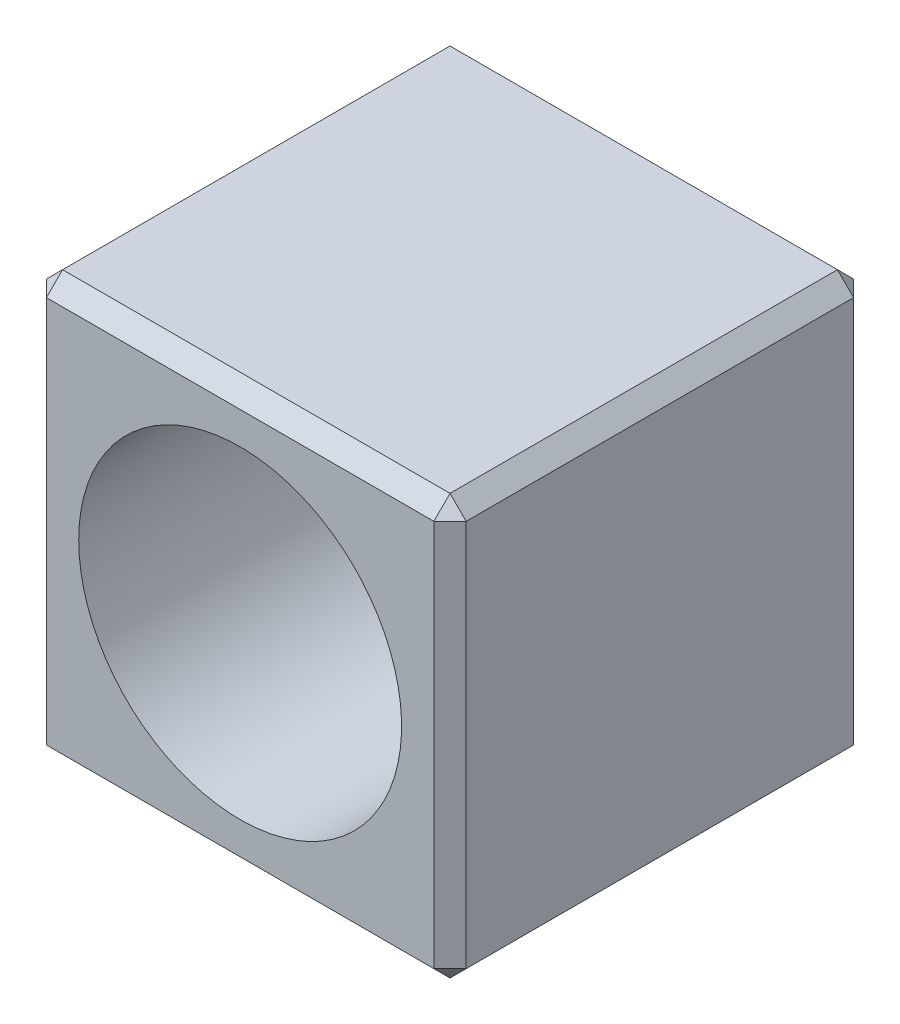
ISO-10303-21;
HEADER;
FILE_DESCRIPTION(('STEP AP214'),'2;1');
FILE_NAME('part.step','',(''),(''),'','','');
FILE_SCHEMA(('AUTOMOTIVE_DESIGN { 1 0 10303 214 1 1 1 1 }'));
ENDSEC;
DATA;
#1=APPLICATION_CONTEXT('core data for automotive mechanical design processes');
#2=APPLICATION_PROTOCOL_DEFINITION('international standard','automotive_design',2000,#1);
#3=PRODUCT_CONTEXT('',#1,'mechanical');
#4=PRODUCT('Part','Part','',(#3));
#5=PRODUCT_RELATED_PRODUCT_CATEGORY('part','',(#4));
#6=PRODUCT_DEFINITION_FORMATION('','',#4);
#7=PRODUCT_DEFINITION_CONTEXT('part definition',#1,'design');
#8=PRODUCT_DEFINITION('design','',#6,#7);
#9=PRODUCT_DEFINITION_SHAPE('','',#8);
#10=(LENGTH_UNIT() NAMED_UNIT(*) SI_UNIT(.MILLI.,.METRE.));
#11=(NAMED_UNIT(*) PLANE_ANGLE_UNIT() SI_UNIT($,.RADIAN.));
#12=(NAMED_UNIT(*) SI_UNIT($,.STERADIAN.) SOLID_ANGLE_UNIT());
#13=UNCERTAINTY_MEASURE_WITH_UNIT(LENGTH_MEASURE(1.E-05),#10,'distance_accuracy_value','');
#14=(GEOMETRIC_REPRESENTATION_CONTEXT(3) GLOBAL_UNCERTAINTY_ASSIGNED_CONTEXT((#13)) GLOBAL_UNIT_ASSIGNED_CONTEXT((#10,
#11,#12)) REPRESENTATION_CONTEXT('',''));
#15=CARTESIAN_POINT('',(0.,0.,0.));
#16=DIRECTION('',(0.,0.,1.));
#17=DIRECTION('',(1.,0.,0.));
#18=AXIS2_PLACEMENT_3D('',#15,#16,#17);
#19=CARTESIAN_POINT('',(0.,0.,13.));
#20=DIRECTION('',(0.,0.,1.));
#21=DIRECTION('',(1.,0.,0.));
#22=AXIS2_PLACEMENT_3D('',#19,#20,#21);
#23=PLANE('',#22);
#24=DIRECTION('',(0.,1.,0.));
#25=VECTOR('',#24,1.);
#26=CARTESIAN_POINT('',(6.,6.5,13.));
#27=LINE('',#26,#25);
#28=CARTESIAN_POINT('',(6.,-6.,13.));
#29=VERTEX_POINT('',#28);
#30=CARTESIAN_POINT('',(6.,6.,13.));
#31=VERTEX_POINT('',#30);
#32=EDGE_CURVE('E184',#29,#31,#27,.T.);
#33=ORIENTED_EDGE('',*,*,#32,.T.);
#34=DIRECTION('',(-1.,0.,0.));
#35=VECTOR('',#34,1.);
#36=CARTESIAN_POINT('',(-6.5,6.,13.));
#37=LINE('',#36,#35);
#38=CARTESIAN_POINT('',(-6.,6.,13.));
#39=VERTEX_POINT('',#38);
#40=EDGE_CURVE('E190',#31,#39,#37,.T.);
#41=ORIENTED_EDGE('',*,*,#40,.T.);
#42=DIRECTION('',(0.,-1.,0.));
#43=VECTOR('',#42,1.);
#44=CARTESIAN_POINT('',(-6.,-6.5,13.));
#45=LINE('',#44,#43);
#46=CARTESIAN_POINT('',(-6.,-6.,13.));
#47=VERTEX_POINT('',#46);
#48=EDGE_CURVE('E188',#39,#47,#45,.T.);
#49=ORIENTED_EDGE('',*,*,#48,.T.);
#50=DIRECTION('',(1.,0.,0.));
#51=VECTOR('',#50,1.);
#52=CARTESIAN_POINT('',(6.5,-6.,13.));
#53=LINE('',#52,#51);
#54=EDGE_CURVE('E186',#47,#29,#53,.T.);
#55=ORIENTED_EDGE('',*,*,#54,.T.);
#56=EDGE_LOOP('',(#33,#41,#49,#55));
#57=FACE_BOUND('',#56,.T.);
#58=CARTESIAN_POINT('',(0.,0.,13.));
#59=DIRECTION('',(0.,0.,1.));
#60=DIRECTION('',(1.,0.,0.));
#61=AXIS2_PLACEMENT_3D('',#58,#59,#60);
#62=CIRCLE('',#61,5.);
#63=CARTESIAN_POINT('',(-5.,0.,13.));
#64=VERTEX_POINT('',#63);
#65=EDGE_CURVE('E149',#64,#64,#62,.T.);
#66=ORIENTED_EDGE('',*,*,#65,.F.);
#67=EDGE_LOOP('',(#66));
#68=FACE_BOUND('',#67,.T.);
#69=ADVANCED_FACE('F34',(#57,#68),#23,.T.);
#70=CARTESIAN_POINT('',(0.,0.,0.));
#71=DIRECTION('',(0.,0.,1.));
#72=DIRECTION('',(1.,0.,0.));
#73=AXIS2_PLACEMENT_3D('',#70,#71,#72);
#74=PLANE('',#73);
#75=DIRECTION('',(-1.,0.,0.));
#76=VECTOR('',#75,1.);
#77=CARTESIAN_POINT('',(0.,-6.,0.));
#78=LINE('',#77,#76);
#79=CARTESIAN_POINT('',(6.,-6.,0.));
#80=VERTEX_POINT('',#79);
#81=CARTESIAN_POINT('',(-6.,-6.,0.));
#82=VERTEX_POINT('',#81);
#83=EDGE_CURVE('E131',#80,#82,#78,.T.);
#84=ORIENTED_EDGE('',*,*,#83,.T.);
#85=DIRECTION('',(0.,1.,0.));
#86=VECTOR('',#85,1.);
#87=CARTESIAN_POINT('',(-6.,0.,0.));
#88=LINE('',#87,#86);
#89=CARTESIAN_POINT('',(-6.,6.,0.));
#90=VERTEX_POINT('',#89);
#91=EDGE_CURVE('E164',#82,#90,#88,.T.);
#92=ORIENTED_EDGE('',*,*,#91,.T.);
#93=DIRECTION('',(1.,0.,0.));
#94=VECTOR('',#93,1.);
#95=CARTESIAN_POINT('',(0.,6.,0.));
#96=LINE('',#95,#94);
#97=CARTESIAN_POINT('',(6.,6.,0.));
#98=VERTEX_POINT('',#97);
#99=EDGE_CURVE('E157',#90,#98,#96,.T.);
#100=ORIENTED_EDGE('',*,*,#99,.T.);
#101=DIRECTION('',(0.,-1.,0.));
#102=VECTOR('',#101,1.);
#103=CARTESIAN_POINT('',(6.,0.,0.));
#104=LINE('',#103,#102);
#105=EDGE_CURVE('E155',#98,#80,#104,.T.);
#106=ORIENTED_EDGE('',*,*,#105,.T.);
#107=EDGE_LOOP('',(#84,#92,#100,#106));
#108=FACE_BOUND('',#107,.T.);
#109=CARTESIAN_POINT('',(0.,0.,0.));
#110=DIRECTION('',(0.,0.,1.));
#111=DIRECTION('',(1.,0.,0.));
#112=AXIS2_PLACEMENT_3D('',#109,#110,#111);
#113=CIRCLE('',#112,5.);
#114=CARTESIAN_POINT('',(-5.,0.,0.));
#115=VERTEX_POINT('',#114);
#116=EDGE_CURVE('E255',#115,#115,#113,.T.);
#117=ORIENTED_EDGE('',*,*,#116,.T.);
#118=EDGE_LOOP('',(#117));
#119=FACE_BOUND('',#118,.T.);
#120=ADVANCED_FACE('F289',(#108,#119),#74,.F.);
#121=CARTESIAN_POINT('',(6.5,6.5,13.));
#122=DIRECTION('',(-1.,0.,0.));
#123=DIRECTION('',(0.,0.,1.));
#124=AXIS2_PLACEMENT_3D('',#121,#122,#123);
#125=PLANE('',#124);
#126=DIRECTION('',(0.,-1.,0.));
#127=VECTOR('',#126,1.);
#128=CARTESIAN_POINT('',(6.5,-6.5,12.5));
#129=LINE('',#128,#127);
#130=CARTESIAN_POINT('',(6.5,6.,12.5));
#131=VERTEX_POINT('',#130);
#132=CARTESIAN_POINT('',(6.5,-6.,12.5));
#133=VERTEX_POINT('',#132);
#134=EDGE_CURVE('E193',#131,#133,#129,.T.);
#135=ORIENTED_EDGE('',*,*,#134,.T.);
#136=DIRECTION('',(0.,0.,-1.));
#137=VECTOR('',#136,1.);
#138=CARTESIAN_POINT('',(6.5,-6.,13.));
#139=LINE('',#138,#137);
#140=CARTESIAN_POINT('',(6.5,-6.,0.5));
#141=VERTEX_POINT('',#140);
#142=EDGE_CURVE('E11',#133,#141,#139,.T.);
#143=ORIENTED_EDGE('',*,*,#142,.T.);
#144=DIRECTION('',(0.,1.,0.));
#145=VECTOR('',#144,1.);
#146=CARTESIAN_POINT('',(6.5,6.5,0.5));
#147=LINE('',#146,#145);
#148=CARTESIAN_POINT('',(6.5,6.,0.5));
#149=VERTEX_POINT('',#148);
#150=EDGE_CURVE('E43',#141,#149,#147,.T.);
#151=ORIENTED_EDGE('',*,*,#150,.T.);
#152=DIRECTION('',(0.,0.,1.));
#153=VECTOR('',#152,1.);
#154=CARTESIAN_POINT('',(6.5,6.,13.));
#155=LINE('',#154,#153);
#156=EDGE_CURVE('E195',#149,#131,#155,.T.);
#157=ORIENTED_EDGE('',*,*,#156,.T.);
#158=EDGE_LOOP('',(#135,#143,#151,#157));
#159=FACE_BOUND('',#158,.T.);
#160=ADVANCED_FACE('F295',(#159),#125,.F.);
#161=CARTESIAN_POINT('',(-6.5,6.5,13.));
#162=DIRECTION('',(0.,-1.,0.));
#163=DIRECTION('',(0.,0.,-1.));
#164=AXIS2_PLACEMENT_3D('',#161,#162,#163);
#165=PLANE('',#164);
#166=DIRECTION('',(0.,0.,-1.));
#167=VECTOR('',#166,1.);
#168=CARTESIAN_POINT('',(6.,6.5,13.));
#169=LINE('',#168,#167);
#170=CARTESIAN_POINT('',(6.,6.5,12.5));
#171=VERTEX_POINT('',#170);
#172=CARTESIAN_POINT('',(6.,6.5,0.5));
#173=VERTEX_POINT('',#172);
#174=EDGE_CURVE('E166',#171,#173,#169,.T.);
#175=ORIENTED_EDGE('',*,*,#174,.T.);
#176=DIRECTION('',(-1.,0.,0.));
#177=VECTOR('',#176,1.);
#178=CARTESIAN_POINT('',(-6.5,6.5,0.5));
#179=LINE('',#178,#177);
#180=CARTESIAN_POINT('',(-6.,6.5,0.5));
#181=VERTEX_POINT('',#180);
#182=EDGE_CURVE('E172',#173,#181,#179,.T.);
#183=ORIENTED_EDGE('',*,*,#182,.T.);
#184=DIRECTION('',(0.,0.,1.));
#185=VECTOR('',#184,1.);
#186=CARTESIAN_POINT('',(-6.,6.5,13.));
#187=LINE('',#186,#185);
#188=CARTESIAN_POINT('',(-6.,6.5,12.5));
#189=VERTEX_POINT('',#188);
#190=EDGE_CURVE('E170',#181,#189,#187,.T.);
#191=ORIENTED_EDGE('',*,*,#190,.T.);
#192=DIRECTION('',(1.,0.,0.));
#193=VECTOR('',#192,1.);
#194=CARTESIAN_POINT('',(6.5,6.5,12.5));
#195=LINE('',#194,#193);
#196=EDGE_CURVE('E168',#189,#171,#195,.T.);
#197=ORIENTED_EDGE('',*,*,#196,.T.);
#198=EDGE_LOOP('',(#175,#183,#191,#197));
#199=FACE_BOUND('',#198,.T.);
#200=ADVANCED_FACE('F330',(#199),#165,.F.);
#201=CARTESIAN_POINT('',(-6.5,6.5,13.));
#202=DIRECTION('',(1.,0.,0.));
#203=DIRECTION('',(0.,0.,-1.));
#204=AXIS2_PLACEMENT_3D('',#201,#202,#203);
#205=PLANE('',#204);
#206=DIRECTION('',(0.,0.,-1.));
#207=VECTOR('',#206,1.);
#208=CARTESIAN_POINT('',(-6.5,6.,13.));
#209=LINE('',#208,#207);
#210=CARTESIAN_POINT('',(-6.5,6.,12.5));
#211=VERTEX_POINT('',#210);
#212=CARTESIAN_POINT('',(-6.5,6.,0.5));
#213=VERTEX_POINT('',#212);
#214=EDGE_CURVE('E177',#211,#213,#209,.T.);
#215=ORIENTED_EDGE('',*,*,#214,.T.);
#216=DIRECTION('',(0.,-1.,0.));
#217=VECTOR('',#216,1.);
#218=CARTESIAN_POINT('',(-6.5,6.5,0.5));
#219=LINE('',#218,#217);
#220=CARTESIAN_POINT('',(-6.5,-6.,0.5));
#221=VERTEX_POINT('',#220);
#222=EDGE_CURVE('E181',#213,#221,#219,.T.);
#223=ORIENTED_EDGE('',*,*,#222,.T.);
#224=DIRECTION('',(0.,0.,1.));
#225=VECTOR('',#224,1.);
#226=CARTESIAN_POINT('',(-6.5,-6.,13.));
#227=LINE('',#226,#225);
#228=CARTESIAN_POINT('',(-6.5,-6.,12.5));
#229=VERTEX_POINT('',#228);
#230=EDGE_CURVE('E179',#221,#229,#227,.T.);
#231=ORIENTED_EDGE('',*,*,#230,.T.);
#232=DIRECTION('',(0.,1.,0.));
#233=VECTOR('',#232,1.);
#234=CARTESIAN_POINT('',(-6.5,6.5,12.5));
#235=LINE('',#234,#233);
#236=EDGE_CURVE('E175',#229,#211,#235,.T.);
#237=ORIENTED_EDGE('',*,*,#236,.T.);
#238=EDGE_LOOP('',(#215,#223,#231,#237));
#239=FACE_BOUND('',#238,.T.);
#240=ADVANCED_FACE('F327',(#239),#205,.F.);
#241=CARTESIAN_POINT('',(-6.5,-6.5,13.));
#242=DIRECTION('',(0.,1.,0.));
#243=DIRECTION('',(0.,0.,1.));
#244=AXIS2_PLACEMENT_3D('',#241,#242,#243);
#245=PLANE('',#244);
#246=DIRECTION('',(0.,0.,-1.));
#247=VECTOR('',#246,1.);
#248=CARTESIAN_POINT('',(-6.,-6.5,13.));
#249=LINE('',#248,#247);
#250=CARTESIAN_POINT('',(-6.,-6.5,12.5));
#251=VERTEX_POINT('',#250);
#252=CARTESIAN_POINT('',(-6.,-6.5,0.5));
#253=VERTEX_POINT('',#252);
#254=EDGE_CURVE('E153',#251,#253,#249,.T.);
#255=ORIENTED_EDGE('',*,*,#254,.T.);
#256=DIRECTION('',(1.,0.,0.));
#257=VECTOR('',#256,1.);
#258=CARTESIAN_POINT('',(-6.5,-6.5,0.5));
#259=LINE('',#258,#257);
#260=CARTESIAN_POINT('',(6.,-6.5,0.5));
#261=VERTEX_POINT('',#260);
#262=EDGE_CURVE('E129',#253,#261,#259,.T.);
#263=ORIENTED_EDGE('',*,*,#262,.T.);
#264=DIRECTION('',(0.,0.,1.));
#265=VECTOR('',#264,1.);
#266=CARTESIAN_POINT('',(6.,-6.5,13.));
#267=LINE('',#266,#265);
#268=CARTESIAN_POINT('',(6.,-6.5,12.5));
#269=VERTEX_POINT('',#268);
#270=EDGE_CURVE('E142',#261,#269,#267,.T.);
#271=ORIENTED_EDGE('',*,*,#270,.T.);
#272=DIRECTION('',(-1.,0.,0.));
#273=VECTOR('',#272,1.);
#274=CARTESIAN_POINT('',(-6.5,-6.5,12.5));
#275=LINE('',#274,#273);
#276=EDGE_CURVE('E148',#269,#251,#275,.T.);
#277=ORIENTED_EDGE('',*,*,#276,.T.);
#278=EDGE_LOOP('',(#255,#263,#271,#277));
#279=FACE_BOUND('',#278,.T.);
#280=ADVANCED_FACE('F151',(#279),#245,.F.);
#281=CARTESIAN_POINT('',(0.,0.,13.));
#282=DIRECTION('',(0.,0.,-1.));
#283=DIRECTION('',(-1.,0.,0.));
#284=AXIS2_PLACEMENT_3D('',#281,#282,#283);
#285=CYLINDRICAL_SURFACE('',#284,5.);
#286=CARTESIAN_POINT('',(-5.,0.,13.));
#287=CARTESIAN_POINT('',(-5.,0.,12.8645833333333));
#288=CARTESIAN_POINT('',(-5.,0.,12.7291666666667));
#289=CARTESIAN_POINT('',(-5.,0.,12.4583333333333));
#290=CARTESIAN_POINT('',(-5.,0.,12.3229166666667));
#291=CARTESIAN_POINT('',(-5.,0.,12.0520833333333));
#292=CARTESIAN_POINT('',(-5.,0.,11.9166666666667));
#293=CARTESIAN_POINT('',(-5.,0.,11.6458333333333));
#294=CARTESIAN_POINT('',(-5.,0.,11.5104166666667));
#295=CARTESIAN_POINT('',(-5.,0.,11.2395833333333));
#296=CARTESIAN_POINT('',(-5.,0.,11.1041666666667));
#297=CARTESIAN_POINT('',(-5.,0.,10.8333333333333));
#298=CARTESIAN_POINT('',(-5.,0.,10.6979166666667));
#299=CARTESIAN_POINT('',(-5.,0.,10.4270833333333));
#300=CARTESIAN_POINT('',(-5.,0.,10.2916666666667));
#301=CARTESIAN_POINT('',(-5.,0.,10.0208333333333));
#302=CARTESIAN_POINT('',(-5.,0.,9.88541666666667));
#303=CARTESIAN_POINT('',(-5.,0.,9.61458333333333));
#304=CARTESIAN_POINT('',(-5.,0.,9.47916666666667));
#305=CARTESIAN_POINT('',(-5.,0.,9.20833333333333));
#306=CARTESIAN_POINT('',(-5.,0.,9.07291666666667));
#307=CARTESIAN_POINT('',(-5.,0.,8.80208333333333));
#308=CARTESIAN_POINT('',(-5.,0.,8.66666666666667));
#309=CARTESIAN_POINT('',(-5.,0.,8.39583333333333));
#310=CARTESIAN_POINT('',(-5.,0.,8.26041666666667));
#311=CARTESIAN_POINT('',(-5.,0.,7.98958333333333));
#312=CARTESIAN_POINT('',(-5.,0.,7.85416666666667));
#313=CARTESIAN_POINT('',(-5.,0.,7.58333333333333));
#314=CARTESIAN_POINT('',(-5.,0.,7.44791666666667));
#315=CARTESIAN_POINT('',(-5.,0.,7.17708333333333));
#316=CARTESIAN_POINT('',(-5.,0.,7.04166666666667));
#317=CARTESIAN_POINT('',(-5.,0.,6.77083333333333));
#318=CARTESIAN_POINT('',(-5.,0.,6.63541666666667));
#319=CARTESIAN_POINT('',(-5.,0.,6.36458333333333));
#320=CARTESIAN_POINT('',(-5.,0.,6.22916666666667));
#321=CARTESIAN_POINT('',(-5.,0.,5.95833333333333));
#322=CARTESIAN_POINT('',(-5.,0.,5.82291666666667));
#323=CARTESIAN_POINT('',(-5.,0.,5.55208333333333));
#324=CARTESIAN_POINT('',(-5.,0.,5.41666666666667));
#325=CARTESIAN_POINT('',(-5.,0.,5.14583333333333));
#326=CARTESIAN_POINT('',(-5.,0.,5.01041666666667));
#327=CARTESIAN_POINT('',(-5.,0.,4.73958333333333));
#328=CARTESIAN_POINT('',(-5.,0.,4.60416666666667));
#329=CARTESIAN_POINT('',(-5.,0.,4.33333333333333));
#330=CARTESIAN_POINT('',(-5.,0.,4.19791666666667));
#331=CARTESIAN_POINT('',(-5.,0.,3.92708333333333));
#332=CARTESIAN_POINT('',(-5.,0.,3.79166666666667));
#333=CARTESIAN_POINT('',(-5.,0.,3.52083333333333));
#334=CARTESIAN_POINT('',(-5.,0.,3.38541666666667));
#335=CARTESIAN_POINT('',(-5.,0.,3.11458333333333));
#336=CARTESIAN_POINT('',(-5.,0.,2.97916666666667));
#337=CARTESIAN_POINT('',(-5.,0.,2.70833333333333));
#338=CARTESIAN_POINT('',(-5.,0.,2.57291666666667));
#339=CARTESIAN_POINT('',(-5.,0.,2.30208333333333));
#340=CARTESIAN_POINT('',(-5.,0.,2.16666666666667));
#341=CARTESIAN_POINT('',(-5.,0.,1.89583333333333));
#342=CARTESIAN_POINT('',(-5.,0.,1.76041666666667));
#343=CARTESIAN_POINT('',(-5.,0.,1.48958333333333));
#344=CARTESIAN_POINT('',(-5.,0.,1.35416666666667));
#345=CARTESIAN_POINT('',(-5.,0.,1.08333333333333));
#346=CARTESIAN_POINT('',(-5.,0.,0.947916666666667));
#347=CARTESIAN_POINT('',(-5.,0.,0.677083333333334));
#348=CARTESIAN_POINT('',(-5.,0.,0.541666666666667));
#349=CARTESIAN_POINT('',(-5.,0.,0.270833333333334));
#350=CARTESIAN_POINT('',(-5.,0.,0.135416666666667));
#351=CARTESIAN_POINT('',(-5.,0.,0.));
#352=B_SPLINE_CURVE_WITH_KNOTS('',3,(#286,#287,#288,#289,#290,#291,#292,#293,#294,#295,#296,
#297,#298,#299,#300,#301,#302,#303,#304,#305,#306,#307,#308,#309,#310,#311,#312,#313,#314,#315,
#316,#317,#318,#319,#320,#321,#322,#323,#324,#325,#326,#327,#328,#329,#330,#331,#332,#333,#334,
#335,#336,#337,#338,#339,#340,#341,#342,#343,#344,#345,#346,#347,#348,#349,#350,#351),
.UNSPECIFIED.,.F.,.F.,(4,2,2,2,2,2,2,2,2,2,2,2,2,2,2,2,2,2,2,2,2,2,2,2,2,2,2,2,2,2,2,2,4),(0.,
0.406249999999999,0.812499999999999,1.21875,1.625,2.03125,2.4375,2.84375,3.25,3.65625,4.0625,
4.46875,4.875,5.28125,5.6875,6.09375,6.5,6.90625,7.3125,7.71875,8.125,8.53125,8.9375,9.34375,
9.75,10.15625,10.5625,10.96875,11.375,11.78125,12.1875,12.59375,13.),.UNSPECIFIED.);
#353=EDGE_CURVE('BSEAM323',#64,#115,#352,.T.);
#354=ORIENTED_EDGE('',*,*,#65,.T.);
#355=ORIENTED_EDGE('',*,*,#116,.F.);
#356=ORIENTED_EDGE('',*,*,#353,.T.);
#357=ORIENTED_EDGE('',*,*,#353,.F.);
#358=EDGE_LOOP('',(#354,#356,#355,#357));
#359=FACE_BOUND('',#358,.T.);
#360=ADVANCED_FACE('F323',(#359),#285,.F.);
#361=CARTESIAN_POINT('',(0.,6.,13.));
#362=DIRECTION('',(0.,0.707106781186547,0.707106781186547));
#363=DIRECTION('',(1.,0.,0.));
#364=AXIS2_PLACEMENT_3D('',#361,#362,#363);
#365=PLANE('',#364);
#366=DIRECTION('',(0.,0.707106781186547,-0.707106781186547));
#367=VECTOR('',#366,1.);
#368=CARTESIAN_POINT('',(-6.,6.5,12.5));
#369=LINE('',#368,#367);
#370=EDGE_CURVE('E38',#39,#189,#369,.T.);
#371=ORIENTED_EDGE('',*,*,#370,.F.);
#372=ORIENTED_EDGE('',*,*,#40,.F.);
#373=DIRECTION('',(0.,-0.707106781186547,0.707106781186547));
#374=VECTOR('',#373,1.);
#375=CARTESIAN_POINT('',(6.,6.5,12.5));
#376=LINE('',#375,#374);
#377=EDGE_CURVE('E248',#171,#31,#376,.T.);
#378=ORIENTED_EDGE('',*,*,#377,.F.);
#379=ORIENTED_EDGE('',*,*,#196,.F.);
#380=EDGE_LOOP('',(#371,#372,#378,#379));
#381=FACE_BOUND('',#380,.T.);
#382=ADVANCED_FACE('F36',(#381),#365,.T.);
#383=CARTESIAN_POINT('',(-6.,6.5,12.5));
#384=DIRECTION('',(-0.577350269189626,0.577350269189626,0.577350269189626));
#385=DIRECTION('',(0.707106781186547,0.,0.707106781186547));
#386=AXIS2_PLACEMENT_3D('',#383,#384,#385);
#387=PLANE('',#386);
#388=DIRECTION('',(0.707106781186547,0.,0.707106781186547));
#389=VECTOR('',#388,1.);
#390=CARTESIAN_POINT('',(-6.25,6.,12.75));
#391=LINE('',#390,#389);
#392=EDGE_CURVE('E243',#39,#211,#391,.F.);
#393=ORIENTED_EDGE('',*,*,#392,.F.);
#394=ORIENTED_EDGE('',*,*,#370,.T.);
#395=DIRECTION('',(0.707106781186547,0.707106781186547,0.));
#396=VECTOR('',#395,1.);
#397=CARTESIAN_POINT('',(-6.,6.5,12.5));
#398=LINE('',#397,#396);
#399=EDGE_CURVE('E246',#211,#189,#398,.T.);
#400=ORIENTED_EDGE('',*,*,#399,.F.);
#401=EDGE_LOOP('',(#393,#394,#400));
#402=FACE_BOUND('',#401,.T.);
#403=ADVANCED_FACE('F472',(#402),#387,.T.);
#404=CARTESIAN_POINT('',(6.,6.5,12.5));
#405=DIRECTION('',(0.577350269189626,0.577350269189626,0.577350269189626));
#406=DIRECTION('',(0.707106781186547,0.,-0.707106781186547));
#407=AXIS2_PLACEMENT_3D('',#404,#405,#406);
#408=PLANE('',#407);
#409=DIRECTION('',(0.707106781186547,-0.707106781186547,0.));
#410=VECTOR('',#409,1.);
#411=CARTESIAN_POINT('',(6.,6.5,12.5));
#412=LINE('',#411,#410);
#413=EDGE_CURVE('E237',#171,#131,#412,.T.);
#414=ORIENTED_EDGE('',*,*,#413,.F.);
#415=ORIENTED_EDGE('',*,*,#377,.T.);
#416=DIRECTION('',(0.707106781186547,0.,-0.707106781186547));
#417=VECTOR('',#416,1.);
#418=CARTESIAN_POINT('',(6.25,6.,12.75));
#419=LINE('',#418,#417);
#420=EDGE_CURVE('E240',#131,#31,#419,.F.);
#421=ORIENTED_EDGE('',*,*,#420,.F.);
#422=EDGE_LOOP('',(#414,#415,#421));
#423=FACE_BOUND('',#422,.T.);
#424=ADVANCED_FACE('F463',(#423),#408,.T.);
#425=CARTESIAN_POINT('',(-6.5,6.,13.));
#426=DIRECTION('',(0.707106781186547,-0.707106781186547,0.));
#427=DIRECTION('',(0.,0.,-1.));
#428=AXIS2_PLACEMENT_3D('',#425,#426,#427);
#429=PLANE('',#428);
#430=ORIENTED_EDGE('',*,*,#399,.T.);
#431=ORIENTED_EDGE('',*,*,#190,.F.);
#432=DIRECTION('',(-0.707106781186547,-0.707106781186547,0.));
#433=VECTOR('',#432,1.);
#434=CARTESIAN_POINT('',(-6.,6.5,0.5));
#435=LINE('',#434,#433);
#436=EDGE_CURVE('E232',#213,#181,#435,.F.);
#437=ORIENTED_EDGE('',*,*,#436,.F.);
#438=ORIENTED_EDGE('',*,*,#214,.F.);
#439=EDGE_LOOP('',(#430,#431,#437,#438));
#440=FACE_BOUND('',#439,.T.);
#441=ADVANCED_FACE('F454',(#440),#429,.F.);
#442=CARTESIAN_POINT('',(-6.,0.,13.));
#443=DIRECTION('',(-0.707106781186547,0.,0.707106781186547));
#444=DIRECTION('',(0.,1.,0.));
#445=AXIS2_PLACEMENT_3D('',#442,#443,#444);
#446=PLANE('',#445);
#447=ORIENTED_EDGE('',*,*,#392,.T.);
#448=ORIENTED_EDGE('',*,*,#236,.F.);
#449=DIRECTION('',(-0.707106781186547,0.,-0.707106781186547));
#450=VECTOR('',#449,1.);
#451=CARTESIAN_POINT('',(-6.5,-6.,12.5));
#452=LINE('',#451,#450);
#453=EDGE_CURVE('E229',#47,#229,#452,.T.);
#454=ORIENTED_EDGE('',*,*,#453,.F.);
#455=ORIENTED_EDGE('',*,*,#48,.F.);
#456=EDGE_LOOP('',(#447,#448,#454,#455));
#457=FACE_BOUND('',#456,.T.);
#458=ADVANCED_FACE('F446',(#457),#446,.T.);
#459=CARTESIAN_POINT('',(0.,-6.,13.));
#460=DIRECTION('',(0.,-0.707106781186547,0.707106781186547));
#461=DIRECTION('',(-1.,0.,0.));
#462=AXIS2_PLACEMENT_3D('',#459,#460,#461);
#463=PLANE('',#462);
#464=DIRECTION('',(0.,-0.707106781186547,-0.707106781186547));
#465=VECTOR('',#464,1.);
#466=CARTESIAN_POINT('',(6.,-6.,13.));
#467=LINE('',#466,#465);
#468=EDGE_CURVE('E223',#29,#269,#467,.T.);
#469=ORIENTED_EDGE('',*,*,#468,.F.);
#470=ORIENTED_EDGE('',*,*,#54,.F.);
#471=DIRECTION('',(0.,0.707106781186547,0.707106781186547));
#472=VECTOR('',#471,1.);
#473=CARTESIAN_POINT('',(-6.,-6.25,12.75));
#474=LINE('',#473,#472);
#475=EDGE_CURVE('E226',#251,#47,#474,.T.);
#476=ORIENTED_EDGE('',*,*,#475,.F.);
#477=ORIENTED_EDGE('',*,*,#276,.F.);
#478=EDGE_LOOP('',(#469,#470,#476,#477));
#479=FACE_BOUND('',#478,.T.);
#480=ADVANCED_FACE('F271',(#479),#463,.T.);
#481=CARTESIAN_POINT('',(6.,0.,13.));
#482=DIRECTION('',(0.707106781186547,0.,0.707106781186547));
#483=DIRECTION('',(0.,-1.,0.));
#484=AXIS2_PLACEMENT_3D('',#481,#482,#483);
#485=PLANE('',#484);
#486=ORIENTED_EDGE('',*,*,#420,.T.);
#487=ORIENTED_EDGE('',*,*,#32,.F.);
#488=DIRECTION('',(-0.707106781186547,0.,0.707106781186547));
#489=VECTOR('',#488,1.);
#490=CARTESIAN_POINT('',(6.,-6.,13.));
#491=LINE('',#490,#489);
#492=EDGE_CURVE('E220',#133,#29,#491,.T.);
#493=ORIENTED_EDGE('',*,*,#492,.F.);
#494=ORIENTED_EDGE('',*,*,#134,.F.);
#495=EDGE_LOOP('',(#486,#487,#493,#494));
#496=FACE_BOUND('',#495,.T.);
#497=ADVANCED_FACE('F300',(#496),#485,.T.);
#498=CARTESIAN_POINT('',(6.,6.5,13.));
#499=DIRECTION('',(-0.707106781186547,-0.707106781186547,0.));
#500=DIRECTION('',(0.,0.,-1.));
#501=AXIS2_PLACEMENT_3D('',#498,#499,#500);
#502=PLANE('',#501);
#503=ORIENTED_EDGE('',*,*,#413,.T.);
#504=ORIENTED_EDGE('',*,*,#156,.F.);
#505=DIRECTION('',(-0.707106781186547,0.707106781186547,0.));
#506=VECTOR('',#505,1.);
#507=CARTESIAN_POINT('',(6.25,6.25,0.5));
#508=LINE('',#507,#506);
#509=EDGE_CURVE('E217',#173,#149,#508,.F.);
#510=ORIENTED_EDGE('',*,*,#509,.F.);
#511=ORIENTED_EDGE('',*,*,#174,.F.);
#512=EDGE_LOOP('',(#503,#504,#510,#511));
#513=FACE_BOUND('',#512,.T.);
#514=ADVANCED_FACE('F422',(#513),#502,.F.);
#515=CARTESIAN_POINT('',(-6.5,6.5,0.5));
#516=DIRECTION('',(0.,-0.707106781186547,0.707106781186547));
#517=DIRECTION('',(-1.,0.,0.));
#518=AXIS2_PLACEMENT_3D('',#515,#516,#517);
#519=PLANE('',#518);
#520=DIRECTION('',(0.,0.707106781186547,0.707106781186547));
#521=VECTOR('',#520,1.);
#522=CARTESIAN_POINT('',(-6.,6.5,0.5));
#523=LINE('',#522,#521);
#524=EDGE_CURVE('E234',#181,#90,#523,.F.);
#525=ORIENTED_EDGE('',*,*,#524,.F.);
#526=ORIENTED_EDGE('',*,*,#182,.F.);
#527=DIRECTION('',(0.,-0.707106781186547,-0.707106781186547));
#528=VECTOR('',#527,1.);
#529=CARTESIAN_POINT('',(6.,6.,0.));
#530=LINE('',#529,#528);
#531=EDGE_CURVE('E214',#98,#173,#530,.F.);
#532=ORIENTED_EDGE('',*,*,#531,.F.);
#533=ORIENTED_EDGE('',*,*,#99,.F.);
#534=EDGE_LOOP('',(#525,#526,#532,#533));
#535=FACE_BOUND('',#534,.T.);
#536=ADVANCED_FACE('F413',(#535),#519,.F.);
#537=CARTESIAN_POINT('',(-6.,6.5,0.5));
#538=DIRECTION('',(-0.577350269189626,0.577350269189626,-0.577350269189626));
#539=DIRECTION('',(-0.707106781186547,0.,0.707106781186547));
#540=AXIS2_PLACEMENT_3D('',#537,#538,#539);
#541=PLANE('',#540);
#542=ORIENTED_EDGE('',*,*,#436,.T.);
#543=ORIENTED_EDGE('',*,*,#524,.T.);
#544=DIRECTION('',(0.707106781186547,0.,-0.707106781186547));
#545=VECTOR('',#544,1.);
#546=CARTESIAN_POINT('',(-6.25,6.,0.25));
#547=LINE('',#546,#545);
#548=EDGE_CURVE('E211',#213,#90,#547,.T.);
#549=ORIENTED_EDGE('',*,*,#548,.F.);
#550=EDGE_LOOP('',(#542,#543,#549));
#551=FACE_BOUND('',#550,.T.);
#552=ADVANCED_FACE('F312',(#551),#541,.T.);
#553=CARTESIAN_POINT('',(-6.5,-6.,12.5));
#554=DIRECTION('',(-0.577350269189626,-0.577350269189626,0.577350269189626));
#555=DIRECTION('',(0.707106781186547,0.,0.707106781186547));
#556=AXIS2_PLACEMENT_3D('',#553,#554,#555);
#557=PLANE('',#556);
#558=ORIENTED_EDGE('',*,*,#475,.T.);
#559=ORIENTED_EDGE('',*,*,#453,.T.);
#560=DIRECTION('',(-0.707106781186547,0.707106781186547,0.));
#561=VECTOR('',#560,1.);
#562=CARTESIAN_POINT('',(-6.5,-6.,12.5));
#563=LINE('',#562,#561);
#564=EDGE_CURVE('E208',#251,#229,#563,.T.);
#565=ORIENTED_EDGE('',*,*,#564,.F.);
#566=EDGE_LOOP('',(#558,#559,#565));
#567=FACE_BOUND('',#566,.T.);
#568=ADVANCED_FACE('F274',(#567),#557,.T.);
#569=CARTESIAN_POINT('',(6.,-6.,13.));
#570=DIRECTION('',(0.577350269189626,-0.577350269189626,0.577350269189626));
#571=DIRECTION('',(0.707106781186547,0.,-0.707106781186547));
#572=AXIS2_PLACEMENT_3D('',#569,#570,#571);
#573=PLANE('',#572);
#574=ORIENTED_EDGE('',*,*,#492,.T.);
#575=ORIENTED_EDGE('',*,*,#468,.T.);
#576=DIRECTION('',(-0.707106781186547,-0.707106781186547,0.));
#577=VECTOR('',#576,1.);
#578=CARTESIAN_POINT('',(6.25,-6.25,12.5));
#579=LINE('',#578,#577);
#580=EDGE_CURVE('E145',#133,#269,#579,.T.);
#581=ORIENTED_EDGE('',*,*,#580,.F.);
#582=EDGE_LOOP('',(#574,#575,#581));
#583=FACE_BOUND('',#582,.T.);
#584=ADVANCED_FACE('F302',(#583),#573,.T.);
#585=CARTESIAN_POINT('',(6.,6.,0.));
#586=DIRECTION('',(0.577350269189626,0.577350269189626,-0.577350269189626));
#587=DIRECTION('',(-0.707106781186547,0.,-0.707106781186547));
#588=AXIS2_PLACEMENT_3D('',#585,#586,#587);
#589=PLANE('',#588);
#590=ORIENTED_EDGE('',*,*,#531,.T.);
#591=ORIENTED_EDGE('',*,*,#509,.T.);
#592=DIRECTION('',(0.707106781186547,0.,0.707106781186547));
#593=VECTOR('',#592,1.);
#594=CARTESIAN_POINT('',(6.,6.,0.));
#595=LINE('',#594,#593);
#596=EDGE_CURVE('E204',#98,#149,#595,.T.);
#597=ORIENTED_EDGE('',*,*,#596,.F.);
#598=EDGE_LOOP('',(#590,#591,#597));
#599=FACE_BOUND('',#598,.T.);
#600=ADVANCED_FACE('F304',(#599),#589,.T.);
#601=CARTESIAN_POINT('',(-6.5,6.5,0.5));
#602=DIRECTION('',(0.707106781186547,0.,0.707106781186547));
#603=DIRECTION('',(0.,-1.,0.));
#604=AXIS2_PLACEMENT_3D('',#601,#602,#603);
#605=PLANE('',#604);
#606=ORIENTED_EDGE('',*,*,#548,.T.);
#607=ORIENTED_EDGE('',*,*,#91,.F.);
#608=DIRECTION('',(-0.707106781186547,0.,0.707106781186547));
#609=VECTOR('',#608,1.);
#610=CARTESIAN_POINT('',(-6.,-6.,0.));
#611=LINE('',#610,#609);
#612=EDGE_CURVE('E201',#221,#82,#611,.F.);
#613=ORIENTED_EDGE('',*,*,#612,.F.);
#614=ORIENTED_EDGE('',*,*,#222,.F.);
#615=EDGE_LOOP('',(#606,#607,#613,#614));
#616=FACE_BOUND('',#615,.T.);
#617=ADVANCED_FACE('F285',(#616),#605,.F.);
#618=CARTESIAN_POINT('',(-6.,-6.5,13.));
#619=DIRECTION('',(0.707106781186547,0.707106781186547,0.));
#620=DIRECTION('',(0.,0.,-1.));
#621=AXIS2_PLACEMENT_3D('',#618,#619,#620);
#622=PLANE('',#621);
#623=ORIENTED_EDGE('',*,*,#564,.T.);
#624=ORIENTED_EDGE('',*,*,#230,.F.);
#625=DIRECTION('',(0.707106781186547,-0.707106781186547,0.));
#626=VECTOR('',#625,1.);
#627=CARTESIAN_POINT('',(-6.25,-6.25,0.5));
#628=LINE('',#627,#626);
#629=EDGE_CURVE('E139',#253,#221,#628,.F.);
#630=ORIENTED_EDGE('',*,*,#629,.F.);
#631=ORIENTED_EDGE('',*,*,#254,.F.);
#632=EDGE_LOOP('',(#623,#624,#630,#631));
#633=FACE_BOUND('',#632,.T.);
#634=ADVANCED_FACE('F277',(#633),#622,.F.);
#635=CARTESIAN_POINT('',(6.5,-6.,13.));
#636=DIRECTION('',(-0.707106781186547,0.707106781186547,0.));
#637=DIRECTION('',(0.,0.,-1.));
#638=AXIS2_PLACEMENT_3D('',#635,#636,#637);
#639=PLANE('',#638);
#640=ORIENTED_EDGE('',*,*,#580,.T.);
#641=ORIENTED_EDGE('',*,*,#270,.F.);
#642=DIRECTION('',(0.707106781186547,0.707106781186547,0.));
#643=VECTOR('',#642,1.);
#644=CARTESIAN_POINT('',(6.,-6.5,0.5));
#645=LINE('',#644,#643);
#646=EDGE_CURVE('E134',#141,#261,#645,.F.);
#647=ORIENTED_EDGE('',*,*,#646,.F.);
#648=ORIENTED_EDGE('',*,*,#142,.F.);
#649=EDGE_LOOP('',(#640,#641,#647,#648));
#650=FACE_BOUND('',#649,.T.);
#651=ADVANCED_FACE('F143',(#650),#639,.F.);
#652=CARTESIAN_POINT('',(6.5,6.5,0.5));
#653=DIRECTION('',(-0.707106781186547,0.,0.707106781186547));
#654=DIRECTION('',(0.,1.,0.));
#655=AXIS2_PLACEMENT_3D('',#652,#653,#654);
#656=PLANE('',#655);
#657=ORIENTED_EDGE('',*,*,#596,.T.);
#658=ORIENTED_EDGE('',*,*,#150,.F.);
#659=DIRECTION('',(-0.707106781186547,0.,-0.707106781186547));
#660=VECTOR('',#659,1.);
#661=CARTESIAN_POINT('',(6.25,-6.,0.25));
#662=LINE('',#661,#660);
#663=EDGE_CURVE('E51',#80,#141,#662,.F.);
#664=ORIENTED_EDGE('',*,*,#663,.F.);
#665=ORIENTED_EDGE('',*,*,#105,.F.);
#666=EDGE_LOOP('',(#657,#658,#664,#665));
#667=FACE_BOUND('',#666,.T.);
#668=ADVANCED_FACE('F293',(#667),#656,.F.);
#669=CARTESIAN_POINT('',(-6.,-6.,0.));
#670=DIRECTION('',(-0.577350269189626,-0.577350269189626,-0.577350269189626));
#671=DIRECTION('',(-0.707106781186547,0.,0.707106781186547));
#672=AXIS2_PLACEMENT_3D('',#669,#670,#671);
#673=PLANE('',#672);
#674=ORIENTED_EDGE('',*,*,#629,.T.);
#675=ORIENTED_EDGE('',*,*,#612,.T.);
#676=DIRECTION('',(0.,0.707106781186547,-0.707106781186547));
#677=VECTOR('',#676,1.);
#678=CARTESIAN_POINT('',(-6.,-6.,0.));
#679=LINE('',#678,#677);
#680=EDGE_CURVE('E132',#253,#82,#679,.T.);
#681=ORIENTED_EDGE('',*,*,#680,.F.);
#682=EDGE_LOOP('',(#674,#675,#681));
#683=FACE_BOUND('',#682,.T.);
#684=ADVANCED_FACE('F281',(#683),#673,.T.);
#685=CARTESIAN_POINT('',(6.,-6.5,0.5));
#686=DIRECTION('',(0.577350269189626,-0.577350269189626,-0.577350269189626));
#687=DIRECTION('',(-0.707106781186547,0.,-0.707106781186547));
#688=AXIS2_PLACEMENT_3D('',#685,#686,#687);
#689=PLANE('',#688);
#690=ORIENTED_EDGE('',*,*,#663,.T.);
#691=ORIENTED_EDGE('',*,*,#646,.T.);
#692=DIRECTION('',(0.,-0.707106781186547,0.707106781186547));
#693=VECTOR('',#692,1.);
#694=CARTESIAN_POINT('',(6.,-6.5,0.5));
#695=LINE('',#694,#693);
#696=EDGE_CURVE('E126',#80,#261,#695,.T.);
#697=ORIENTED_EDGE('',*,*,#696,.F.);
#698=EDGE_LOOP('',(#690,#691,#697));
#699=FACE_BOUND('',#698,.T.);
#700=ADVANCED_FACE('F136',(#699),#689,.T.);
#701=CARTESIAN_POINT('',(-6.5,-6.5,0.5));
#702=DIRECTION('',(0.,0.707106781186547,0.707106781186547));
#703=DIRECTION('',(1.,0.,0.));
#704=AXIS2_PLACEMENT_3D('',#701,#702,#703);
#705=PLANE('',#704);
#706=ORIENTED_EDGE('',*,*,#680,.T.);
#707=ORIENTED_EDGE('',*,*,#83,.F.);
#708=ORIENTED_EDGE('',*,*,#696,.T.);
#709=ORIENTED_EDGE('',*,*,#262,.F.);
#710=EDGE_LOOP('',(#706,#707,#708,#709));
#711=FACE_BOUND('',#710,.T.);
#712=ADVANCED_FACE('F127',(#711),#705,.F.);
#713=CLOSED_SHELL('',(#69,#120,#160,#200,#240,#280,#360,#382,#403,#424,#441,#458,#480,#497,#514,
#536,#552,#568,#584,#600,#617,#634,#651,#668,#684,#700,#712));
#714=MANIFOLD_SOLID_BREP('B2',#713);
#715=ADVANCED_BREP_SHAPE_REPRESENTATION('',(#18,#714),#14);
#716=SHAPE_DEFINITION_REPRESENTATION(#9,#715);
ENDSEC;
END-ISO-10303-21;
